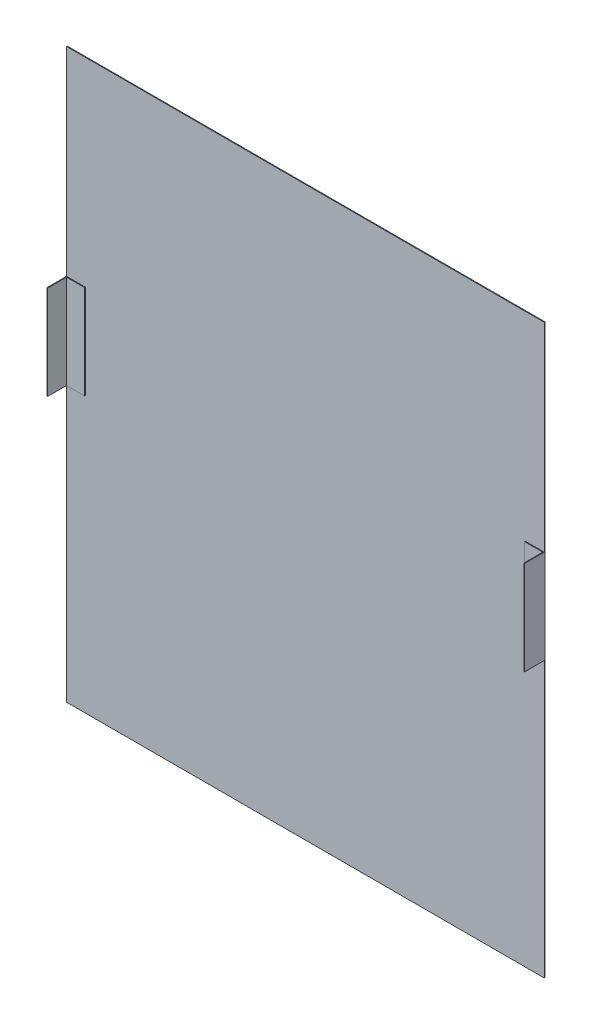
ISO-10303-21;
HEADER;
FILE_DESCRIPTION(('STEP AP214'),'2;1');
FILE_NAME('part.step','',(''),(''),'','','');
FILE_SCHEMA(('AUTOMOTIVE_DESIGN { 1 0 10303 214 1 1 1 1 }'));
ENDSEC;
DATA;
#1=APPLICATION_CONTEXT('core data for automotive mechanical design processes');
#2=APPLICATION_PROTOCOL_DEFINITION('international standard','automotive_design',2000,#1);
#3=PRODUCT_CONTEXT('',#1,'mechanical');
#4=PRODUCT('Part','Part','',(#3));
#5=PRODUCT_RELATED_PRODUCT_CATEGORY('part','',(#4));
#6=PRODUCT_DEFINITION_FORMATION('','',#4);
#7=PRODUCT_DEFINITION_CONTEXT('part definition',#1,'design');
#8=PRODUCT_DEFINITION('design','',#6,#7);
#9=PRODUCT_DEFINITION_SHAPE('','',#8);
#10=(LENGTH_UNIT() NAMED_UNIT(*) SI_UNIT(.MILLI.,.METRE.));
#11=(NAMED_UNIT(*) PLANE_ANGLE_UNIT() SI_UNIT($,.RADIAN.));
#12=(NAMED_UNIT(*) SI_UNIT($,.STERADIAN.) SOLID_ANGLE_UNIT());
#13=UNCERTAINTY_MEASURE_WITH_UNIT(LENGTH_MEASURE(1.E-05),#10,'distance_accuracy_value','');
#14=(GEOMETRIC_REPRESENTATION_CONTEXT(3) GLOBAL_UNCERTAINTY_ASSIGNED_CONTEXT((#13)) GLOBAL_UNIT_ASSIGNED_CONTEXT((#10,
#11,#12)) REPRESENTATION_CONTEXT('',''));
#15=CARTESIAN_POINT('',(0.,0.,0.));
#16=DIRECTION('',(0.,0.,1.));
#17=DIRECTION('',(1.,0.,0.));
#18=AXIS2_PLACEMENT_3D('',#15,#16,#17);
#19=CARTESIAN_POINT('',(0.,0.,1.6));
#20=DIRECTION('',(0.,0.,1.));
#21=DIRECTION('',(1.,0.,0.));
#22=AXIS2_PLACEMENT_3D('',#19,#20,#21);
#23=PLANE('',#22);
#24=DIRECTION('',(-1.,0.,0.));
#25=VECTOR('',#24,1.);
#26=CARTESIAN_POINT('',(0.,292.918789734728,1.6));
#27=LINE('',#26,#25);
#28=CARTESIAN_POINT('',(508.2,292.918789734728,1.6));
#29=VERTEX_POINT('',#28);
#30=CARTESIAN_POINT('',(489.,292.918789734728,1.6));
#31=VERTEX_POINT('',#30);
#32=EDGE_CURVE('E204',#29,#31,#27,.T.);
#33=ORIENTED_EDGE('',*,*,#32,.F.);
#34=DIRECTION('',(0.,1.,0.));
#35=VECTOR('',#34,1.);
#36=CARTESIAN_POINT('',(508.2,392.918789734728,1.6));
#37=LINE('',#36,#35);
#38=CARTESIAN_POINT('',(508.2,392.918789734728,1.6));
#39=VERTEX_POINT('',#38);
#40=EDGE_CURVE('E173',#29,#39,#37,.T.);
#41=ORIENTED_EDGE('',*,*,#40,.T.);
#42=DIRECTION('',(1.,0.,0.));
#43=VECTOR('',#42,1.);
#44=CARTESIAN_POINT('',(0.,392.918789734728,1.6));
#45=LINE('',#44,#43);
#46=CARTESIAN_POINT('',(489.,392.918789734728,1.6));
#47=VERTEX_POINT('',#46);
#48=EDGE_CURVE('E172',#47,#39,#45,.T.);
#49=ORIENTED_EDGE('',*,*,#48,.F.);
#50=DIRECTION('',(0.,-1.,0.));
#51=VECTOR('',#50,1.);
#52=CARTESIAN_POINT('',(489.,0.,1.6));
#53=LINE('',#52,#51);
#54=EDGE_CURVE('E200',#47,#31,#53,.T.);
#55=ORIENTED_EDGE('',*,*,#54,.T.);
#56=EDGE_LOOP('',(#33,#41,#49,#55));
#57=FACE_BOUND('',#56,.T.);
#58=ADVANCED_FACE('F37',(#57),#23,.T.);
#59=CARTESIAN_POINT('',(0.,0.,1.6));
#60=DIRECTION('',(0.,0.,1.));
#61=DIRECTION('',(1.,0.,0.));
#62=AXIS2_PLACEMENT_3D('',#59,#60,#61);
#63=PLANE('',#62);
#64=DIRECTION('',(1.,0.,0.));
#65=VECTOR('',#64,1.);
#66=CARTESIAN_POINT('',(0.,392.918789734728,1.6));
#67=LINE('',#66,#65);
#68=CARTESIAN_POINT('',(0.8,392.918789734728,1.6));
#69=VERTEX_POINT('',#68);
#70=CARTESIAN_POINT('',(20.,392.918789734728,1.6));
#71=VERTEX_POINT('',#70);
#72=EDGE_CURVE('E227',#69,#71,#67,.T.);
#73=ORIENTED_EDGE('',*,*,#72,.F.);
#74=DIRECTION('',(0.,-1.,0.));
#75=VECTOR('',#74,1.);
#76=CARTESIAN_POINT('',(0.8,392.918789734728,1.6));
#77=LINE('',#76,#75);
#78=CARTESIAN_POINT('',(0.8,292.918789734728,1.6));
#79=VERTEX_POINT('',#78);
#80=EDGE_CURVE('E181',#69,#79,#77,.T.);
#81=ORIENTED_EDGE('',*,*,#80,.T.);
#82=DIRECTION('',(1.,0.,0.));
#83=VECTOR('',#82,1.);
#84=CARTESIAN_POINT('',(0.,292.918789734728,1.6));
#85=LINE('',#84,#83);
#86=CARTESIAN_POINT('',(20.,292.918789734728,1.6));
#87=VERTEX_POINT('',#86);
#88=EDGE_CURVE('E230',#79,#87,#85,.T.);
#89=ORIENTED_EDGE('',*,*,#88,.T.);
#90=DIRECTION('',(0.,-1.,0.));
#91=VECTOR('',#90,1.);
#92=CARTESIAN_POINT('',(20.0000000000001,0.,1.6));
#93=LINE('',#92,#91);
#94=EDGE_CURVE('E224',#71,#87,#93,.T.);
#95=ORIENTED_EDGE('',*,*,#94,.F.);
#96=EDGE_LOOP('',(#73,#81,#89,#95));
#97=FACE_BOUND('',#96,.T.);
#98=ADVANCED_FACE('F323',(#97),#63,.T.);
#99=CARTESIAN_POINT('',(0.,0.,0.8));
#100=DIRECTION('',(0.,0.,-1.));
#101=DIRECTION('',(-1.,0.,0.));
#102=AXIS2_PLACEMENT_3D('',#99,#100,#101);
#103=PLANE('',#102);
#104=DIRECTION('',(0.,-1.,0.));
#105=VECTOR('',#104,1.);
#106=CARTESIAN_POINT('',(489.,0.,0.8));
#107=LINE('',#106,#105);
#108=CARTESIAN_POINT('',(489.,392.918789734728,0.8));
#109=VERTEX_POINT('',#108);
#110=CARTESIAN_POINT('',(489.,292.918789734728,0.8));
#111=VERTEX_POINT('',#110);
#112=EDGE_CURVE('E209',#109,#111,#107,.T.);
#113=ORIENTED_EDGE('',*,*,#112,.F.);
#114=DIRECTION('',(1.,0.,0.));
#115=VECTOR('',#114,1.);
#116=CARTESIAN_POINT('',(0.,392.918789734728,0.8));
#117=LINE('',#116,#115);
#118=CARTESIAN_POINT('',(509.,392.918789734728,0.8));
#119=VERTEX_POINT('',#118);
#120=EDGE_CURVE('E196',#109,#119,#117,.T.);
#121=ORIENTED_EDGE('',*,*,#120,.T.);
#122=DIRECTION('',(0.,1.,0.));
#123=VECTOR('',#122,1.);
#124=CARTESIAN_POINT('',(509.,0.,0.8));
#125=LINE('',#124,#123);
#126=CARTESIAN_POINT('',(509.,605.,0.8));
#127=VERTEX_POINT('',#126);
#128=EDGE_CURVE('E255',#119,#127,#125,.T.);
#129=ORIENTED_EDGE('',*,*,#128,.T.);
#130=DIRECTION('',(-1.,0.,0.));
#131=VECTOR('',#130,1.);
#132=CARTESIAN_POINT('',(0.,605.,0.8));
#133=LINE('',#132,#131);
#134=CARTESIAN_POINT('',(0.,605.,0.8));
#135=VERTEX_POINT('',#134);
#136=EDGE_CURVE('E258',#127,#135,#133,.T.);
#137=ORIENTED_EDGE('',*,*,#136,.T.);
#138=DIRECTION('',(0.,-1.,0.));
#139=VECTOR('',#138,1.);
#140=CARTESIAN_POINT('',(0.,0.,0.8));
#141=LINE('',#140,#139);
#142=CARTESIAN_POINT('',(0.,392.918789734728,0.8));
#143=VERTEX_POINT('',#142);
#144=EDGE_CURVE('E249',#135,#143,#141,.T.);
#145=ORIENTED_EDGE('',*,*,#144,.T.);
#146=DIRECTION('',(1.,0.,0.));
#147=VECTOR('',#146,1.);
#148=CARTESIAN_POINT('',(0.,392.918789734728,0.8));
#149=LINE('',#148,#147);
#150=CARTESIAN_POINT('',(20.,392.918789734728,0.8));
#151=VERTEX_POINT('',#150);
#152=EDGE_CURVE('E235',#143,#151,#149,.T.);
#153=ORIENTED_EDGE('',*,*,#152,.T.);
#154=DIRECTION('',(0.,-1.,0.));
#155=VECTOR('',#154,1.);
#156=CARTESIAN_POINT('',(20.0000000000001,0.,0.8));
#157=LINE('',#156,#155);
#158=CARTESIAN_POINT('',(20.,292.918789734728,0.8));
#159=VERTEX_POINT('',#158);
#160=EDGE_CURVE('E223',#151,#159,#157,.T.);
#161=ORIENTED_EDGE('',*,*,#160,.T.);
#162=DIRECTION('',(1.,0.,0.));
#163=VECTOR('',#162,1.);
#164=CARTESIAN_POINT('',(0.,292.918789734728,0.8));
#165=LINE('',#164,#163);
#166=CARTESIAN_POINT('',(0.,292.918789734728,0.8));
#167=VERTEX_POINT('',#166);
#168=EDGE_CURVE('E228',#167,#159,#165,.T.);
#169=ORIENTED_EDGE('',*,*,#168,.F.);
#170=CARTESIAN_POINT('',(0.,0.,0.8));
#171=VERTEX_POINT('',#170);
#172=EDGE_CURVE('E253',#167,#171,#141,.T.);
#173=ORIENTED_EDGE('',*,*,#172,.T.);
#174=DIRECTION('',(1.,0.,0.));
#175=VECTOR('',#174,1.);
#176=CARTESIAN_POINT('',(0.,0.,0.8));
#177=LINE('',#176,#175);
#178=CARTESIAN_POINT('',(509.,0.,0.8));
#179=VERTEX_POINT('',#178);
#180=EDGE_CURVE('E252',#171,#179,#177,.T.);
#181=ORIENTED_EDGE('',*,*,#180,.T.);
#182=CARTESIAN_POINT('',(509.,292.918789734728,0.8));
#183=VERTEX_POINT('',#182);
#184=EDGE_CURVE('E256',#179,#183,#125,.T.);
#185=ORIENTED_EDGE('',*,*,#184,.T.);
#186=DIRECTION('',(-1.,0.,0.));
#187=VECTOR('',#186,1.);
#188=CARTESIAN_POINT('',(0.,292.918789734728,0.8));
#189=LINE('',#188,#187);
#190=EDGE_CURVE('E201',#183,#111,#189,.T.);
#191=ORIENTED_EDGE('',*,*,#190,.T.);
#192=EDGE_LOOP('',(#113,#121,#129,#137,#145,#153,#161,#169,#173,#181,#185,#191));
#193=FACE_BOUND('',#192,.T.);
#194=ADVANCED_FACE('F295',(#193),#103,.F.);
#195=CARTESIAN_POINT('',(0.,0.,0.8));
#196=DIRECTION('',(1.,0.,0.));
#197=DIRECTION('',(0.,0.,-1.));
#198=AXIS2_PLACEMENT_3D('',#195,#196,#197);
#199=PLANE('',#198);
#200=DIRECTION('',(0.,-1.,0.));
#201=VECTOR('',#200,1.);
#202=CARTESIAN_POINT('',(0.,0.,0.));
#203=LINE('',#202,#201);
#204=CARTESIAN_POINT('',(0.,605.,0.));
#205=VERTEX_POINT('',#204);
#206=CARTESIAN_POINT('',(0.,0.,0.));
#207=VERTEX_POINT('',#206);
#208=EDGE_CURVE('E248',#205,#207,#203,.T.);
#209=ORIENTED_EDGE('',*,*,#208,.T.);
#210=DIRECTION('',(0.,0.,-1.));
#211=VECTOR('',#210,1.);
#212=CARTESIAN_POINT('',(0.,0.,0.8));
#213=LINE('',#212,#211);
#214=EDGE_CURVE('E11',#171,#207,#213,.T.);
#215=ORIENTED_EDGE('',*,*,#214,.F.);
#216=ORIENTED_EDGE('',*,*,#172,.F.);
#217=DIRECTION('',(0.,0.,-1.));
#218=VECTOR('',#217,1.);
#219=CARTESIAN_POINT('',(0.,292.918789734728,1.6));
#220=LINE('',#219,#218);
#221=CARTESIAN_POINT('',(0.,292.918789734728,21.6));
#222=VERTEX_POINT('',#221);
#223=EDGE_CURVE('E241',#222,#167,#220,.T.);
#224=ORIENTED_EDGE('',*,*,#223,.F.);
#225=DIRECTION('',(0.,1.,0.));
#226=VECTOR('',#225,1.);
#227=CARTESIAN_POINT('',(0.,392.918789734728,21.6));
#228=LINE('',#227,#226);
#229=CARTESIAN_POINT('',(0.,392.918789734728,21.6));
#230=VERTEX_POINT('',#229);
#231=EDGE_CURVE('E179',#222,#230,#228,.T.);
#232=ORIENTED_EDGE('',*,*,#231,.T.);
#233=DIRECTION('',(0.,0.,-1.));
#234=VECTOR('',#233,1.);
#235=CARTESIAN_POINT('',(0.,392.918789734728,1.6));
#236=LINE('',#235,#234);
#237=EDGE_CURVE('E243',#230,#143,#236,.T.);
#238=ORIENTED_EDGE('',*,*,#237,.T.);
#239=ORIENTED_EDGE('',*,*,#144,.F.);
#240=DIRECTION('',(0.,0.,-1.));
#241=VECTOR('',#240,1.);
#242=CARTESIAN_POINT('',(0.,605.,0.8));
#243=LINE('',#242,#241);
#244=EDGE_CURVE('E260',#135,#205,#243,.T.);
#245=ORIENTED_EDGE('',*,*,#244,.T.);
#246=EDGE_LOOP('',(#209,#215,#216,#224,#232,#238,#239,#245));
#247=FACE_BOUND('',#246,.T.);
#248=ADVANCED_FACE('F39',(#247),#199,.F.);
#249=CARTESIAN_POINT('',(0.,0.,0.8));
#250=DIRECTION('',(0.,1.,0.));
#251=DIRECTION('',(0.,0.,1.));
#252=AXIS2_PLACEMENT_3D('',#249,#250,#251);
#253=PLANE('',#252);
#254=DIRECTION('',(1.,0.,0.));
#255=VECTOR('',#254,1.);
#256=CARTESIAN_POINT('',(0.,0.,0.));
#257=LINE('',#256,#255);
#258=CARTESIAN_POINT('',(509.,0.,0.));
#259=VERTEX_POINT('',#258);
#260=EDGE_CURVE('E263',#207,#259,#257,.T.);
#261=ORIENTED_EDGE('',*,*,#260,.T.);
#262=DIRECTION('',(0.,0.,-1.));
#263=VECTOR('',#262,1.);
#264=CARTESIAN_POINT('',(509.,0.,0.8));
#265=LINE('',#264,#263);
#266=EDGE_CURVE('E45',#179,#259,#265,.T.);
#267=ORIENTED_EDGE('',*,*,#266,.F.);
#268=ORIENTED_EDGE('',*,*,#180,.F.);
#269=ORIENTED_EDGE('',*,*,#214,.T.);
#270=EDGE_LOOP('',(#261,#267,#268,#269));
#271=FACE_BOUND('',#270,.T.);
#272=ADVANCED_FACE('F307',(#271),#253,.F.);
#273=CARTESIAN_POINT('',(509.,0.,0.8));
#274=DIRECTION('',(-1.,0.,0.));
#275=DIRECTION('',(0.,0.,1.));
#276=AXIS2_PLACEMENT_3D('',#273,#274,#275);
#277=PLANE('',#276);
#278=DIRECTION('',(0.,1.,0.));
#279=VECTOR('',#278,1.);
#280=CARTESIAN_POINT('',(509.,0.,0.));
#281=LINE('',#280,#279);
#282=CARTESIAN_POINT('',(509.,605.,0.));
#283=VERTEX_POINT('',#282);
#284=EDGE_CURVE('E265',#259,#283,#281,.T.);
#285=ORIENTED_EDGE('',*,*,#284,.T.);
#286=DIRECTION('',(0.,0.,-1.));
#287=VECTOR('',#286,1.);
#288=CARTESIAN_POINT('',(509.,605.,0.8));
#289=LINE('',#288,#287);
#290=EDGE_CURVE('E271',#127,#283,#289,.T.);
#291=ORIENTED_EDGE('',*,*,#290,.F.);
#292=ORIENTED_EDGE('',*,*,#128,.F.);
#293=DIRECTION('',(0.,0.,-1.));
#294=VECTOR('',#293,1.);
#295=CARTESIAN_POINT('',(509.,392.918789734728,1.6));
#296=LINE('',#295,#294);
#297=CARTESIAN_POINT('',(509.,392.918789734728,21.6));
#298=VERTEX_POINT('',#297);
#299=EDGE_CURVE('E206',#298,#119,#296,.T.);
#300=ORIENTED_EDGE('',*,*,#299,.F.);
#301=DIRECTION('',(0.,-1.,0.));
#302=VECTOR('',#301,1.);
#303=CARTESIAN_POINT('',(509.,392.918789734728,21.6));
#304=LINE('',#303,#302);
#305=CARTESIAN_POINT('',(509.,292.918789734728,21.6));
#306=VERTEX_POINT('',#305);
#307=EDGE_CURVE('E159',#298,#306,#304,.T.);
#308=ORIENTED_EDGE('',*,*,#307,.T.);
#309=DIRECTION('',(0.,0.,-1.));
#310=VECTOR('',#309,1.);
#311=CARTESIAN_POINT('',(509.,292.918789734728,1.6));
#312=LINE('',#311,#310);
#313=EDGE_CURVE('E214',#306,#183,#312,.T.);
#314=ORIENTED_EDGE('',*,*,#313,.T.);
#315=ORIENTED_EDGE('',*,*,#184,.F.);
#316=ORIENTED_EDGE('',*,*,#266,.T.);
#317=EDGE_LOOP('',(#285,#291,#292,#300,#308,#314,#315,#316));
#318=FACE_BOUND('',#317,.T.);
#319=ADVANCED_FACE('F278',(#318),#277,.F.);
#320=CARTESIAN_POINT('',(0.,605.,0.8));
#321=DIRECTION('',(0.,-1.,0.));
#322=DIRECTION('',(0.,0.,-1.));
#323=AXIS2_PLACEMENT_3D('',#320,#321,#322);
#324=PLANE('',#323);
#325=DIRECTION('',(-1.,0.,0.));
#326=VECTOR('',#325,1.);
#327=CARTESIAN_POINT('',(0.,605.,0.));
#328=LINE('',#327,#326);
#329=EDGE_CURVE('E267',#283,#205,#328,.T.);
#330=ORIENTED_EDGE('',*,*,#329,.T.);
#331=ORIENTED_EDGE('',*,*,#244,.F.);
#332=ORIENTED_EDGE('',*,*,#136,.F.);
#333=ORIENTED_EDGE('',*,*,#290,.T.);
#334=EDGE_LOOP('',(#330,#331,#332,#333));
#335=FACE_BOUND('',#334,.T.);
#336=ADVANCED_FACE('F288',(#335),#324,.F.);
#337=CARTESIAN_POINT('',(0.,0.,0.));
#338=DIRECTION('',(0.,0.,-1.));
#339=DIRECTION('',(-1.,0.,0.));
#340=AXIS2_PLACEMENT_3D('',#337,#338,#339);
#341=PLANE('',#340);
#342=ORIENTED_EDGE('',*,*,#208,.F.);
#343=ORIENTED_EDGE('',*,*,#329,.F.);
#344=ORIENTED_EDGE('',*,*,#284,.F.);
#345=ORIENTED_EDGE('',*,*,#260,.F.);
#346=EDGE_LOOP('',(#342,#343,#344,#345));
#347=FACE_BOUND('',#346,.T.);
#348=ADVANCED_FACE('F285',(#347),#341,.T.);
#349=CARTESIAN_POINT('',(20.0000000000001,0.,1.6));
#350=DIRECTION('',(1.,0.,0.));
#351=DIRECTION('',(0.,1.,0.));
#352=AXIS2_PLACEMENT_3D('',#349,#350,#351);
#353=PLANE('',#352);
#354=ORIENTED_EDGE('',*,*,#160,.F.);
#355=DIRECTION('',(0.,0.,-1.));
#356=VECTOR('',#355,1.);
#357=CARTESIAN_POINT('',(20.,392.918789734728,1.6));
#358=LINE('',#357,#356);
#359=EDGE_CURVE('E245',#71,#151,#358,.T.);
#360=ORIENTED_EDGE('',*,*,#359,.F.);
#361=ORIENTED_EDGE('',*,*,#94,.T.);
#362=DIRECTION('',(0.,0.,-1.));
#363=VECTOR('',#362,1.);
#364=CARTESIAN_POINT('',(20.,292.918789734728,1.6));
#365=LINE('',#364,#363);
#366=EDGE_CURVE('E232',#87,#159,#365,.T.);
#367=ORIENTED_EDGE('',*,*,#366,.T.);
#368=EDGE_LOOP('',(#354,#360,#361,#367));
#369=FACE_BOUND('',#368,.T.);
#370=ADVANCED_FACE('F321',(#369),#353,.T.);
#371=CARTESIAN_POINT('',(0.,392.918789734728,1.6));
#372=DIRECTION('',(0.,1.,0.));
#373=DIRECTION('',(0.,0.,1.));
#374=AXIS2_PLACEMENT_3D('',#371,#372,#373);
#375=PLANE('',#374);
#376=ORIENTED_EDGE('',*,*,#152,.F.);
#377=ORIENTED_EDGE('',*,*,#237,.F.);
#378=DIRECTION('',(-1.,0.,0.));
#379=VECTOR('',#378,1.);
#380=CARTESIAN_POINT('',(0.8,392.918789734728,21.6));
#381=LINE('',#380,#379);
#382=CARTESIAN_POINT('',(0.8,392.918789734728,21.6));
#383=VERTEX_POINT('',#382);
#384=EDGE_CURVE('E193',#383,#230,#381,.T.);
#385=ORIENTED_EDGE('',*,*,#384,.F.);
#386=DIRECTION('',(0.,0.,-1.));
#387=VECTOR('',#386,1.);
#388=CARTESIAN_POINT('',(0.8,392.918789734728,1.6));
#389=LINE('',#388,#387);
#390=EDGE_CURVE('E187',#383,#69,#389,.T.);
#391=ORIENTED_EDGE('',*,*,#390,.T.);
#392=ORIENTED_EDGE('',*,*,#72,.T.);
#393=ORIENTED_EDGE('',*,*,#359,.T.);
#394=EDGE_LOOP('',(#376,#377,#385,#391,#392,#393));
#395=FACE_BOUND('',#394,.T.);
#396=ADVANCED_FACE('F316',(#395),#375,.T.);
#397=CARTESIAN_POINT('',(0.,292.918789734728,1.6));
#398=DIRECTION('',(0.,1.,0.));
#399=DIRECTION('',(0.,0.,1.));
#400=AXIS2_PLACEMENT_3D('',#397,#398,#399);
#401=PLANE('',#400);
#402=ORIENTED_EDGE('',*,*,#168,.T.);
#403=ORIENTED_EDGE('',*,*,#366,.F.);
#404=ORIENTED_EDGE('',*,*,#88,.F.);
#405=DIRECTION('',(0.,0.,1.));
#406=VECTOR('',#405,1.);
#407=CARTESIAN_POINT('',(0.8,292.918789734728,1.60000000000001));
#408=LINE('',#407,#406);
#409=CARTESIAN_POINT('',(0.8,292.918789734728,21.6));
#410=VERTEX_POINT('',#409);
#411=EDGE_CURVE('E60',#79,#410,#408,.T.);
#412=ORIENTED_EDGE('',*,*,#411,.T.);
#413=DIRECTION('',(-1.,0.,0.));
#414=VECTOR('',#413,1.);
#415=CARTESIAN_POINT('',(0.8,292.918789734728,21.6));
#416=LINE('',#415,#414);
#417=EDGE_CURVE('E190',#410,#222,#416,.T.);
#418=ORIENTED_EDGE('',*,*,#417,.T.);
#419=ORIENTED_EDGE('',*,*,#223,.T.);
#420=EDGE_LOOP('',(#402,#403,#404,#412,#418,#419));
#421=FACE_BOUND('',#420,.T.);
#422=ADVANCED_FACE('F310',(#421),#401,.F.);
#423=CARTESIAN_POINT('',(0.,392.918789734728,1.6));
#424=DIRECTION('',(0.,1.,0.));
#425=DIRECTION('',(0.,0.,1.));
#426=AXIS2_PLACEMENT_3D('',#423,#424,#425);
#427=PLANE('',#426);
#428=ORIENTED_EDGE('',*,*,#120,.F.);
#429=DIRECTION('',(0.,0.,-1.));
#430=VECTOR('',#429,1.);
#431=CARTESIAN_POINT('',(489.,392.918789734728,1.6));
#432=LINE('',#431,#430);
#433=EDGE_CURVE('E220',#47,#109,#432,.T.);
#434=ORIENTED_EDGE('',*,*,#433,.F.);
#435=ORIENTED_EDGE('',*,*,#48,.T.);
#436=DIRECTION('',(0.,0.,1.));
#437=VECTOR('',#436,1.);
#438=CARTESIAN_POINT('',(508.2,392.918789734728,1.6));
#439=LINE('',#438,#437);
#440=CARTESIAN_POINT('',(508.2,392.918789734728,21.6));
#441=VERTEX_POINT('',#440);
#442=EDGE_CURVE('E52',#39,#441,#439,.T.);
#443=ORIENTED_EDGE('',*,*,#442,.T.);
#444=DIRECTION('',(1.,0.,0.));
#445=VECTOR('',#444,1.);
#446=CARTESIAN_POINT('',(508.2,392.918789734728,21.6));
#447=LINE('',#446,#445);
#448=EDGE_CURVE('E153',#441,#298,#447,.T.);
#449=ORIENTED_EDGE('',*,*,#448,.T.);
#450=ORIENTED_EDGE('',*,*,#299,.T.);
#451=EDGE_LOOP('',(#428,#434,#435,#443,#449,#450));
#452=FACE_BOUND('',#451,.T.);
#453=ADVANCED_FACE('F170',(#452),#427,.T.);
#454=CARTESIAN_POINT('',(489.,0.,1.6));
#455=DIRECTION('',(1.,0.,0.));
#456=DIRECTION('',(0.,0.,-1.));
#457=AXIS2_PLACEMENT_3D('',#454,#455,#456);
#458=PLANE('',#457);
#459=ORIENTED_EDGE('',*,*,#112,.T.);
#460=DIRECTION('',(0.,0.,-1.));
#461=VECTOR('',#460,1.);
#462=CARTESIAN_POINT('',(489.,292.918789734728,1.6));
#463=LINE('',#462,#461);
#464=EDGE_CURVE('E217',#31,#111,#463,.T.);
#465=ORIENTED_EDGE('',*,*,#464,.F.);
#466=ORIENTED_EDGE('',*,*,#54,.F.);
#467=ORIENTED_EDGE('',*,*,#433,.T.);
#468=EDGE_LOOP('',(#459,#465,#466,#467));
#469=FACE_BOUND('',#468,.T.);
#470=ADVANCED_FACE('F299',(#469),#458,.F.);
#471=CARTESIAN_POINT('',(0.,292.918789734728,1.6));
#472=DIRECTION('',(0.,-1.,0.));
#473=DIRECTION('',(0.,0.,-1.));
#474=AXIS2_PLACEMENT_3D('',#471,#472,#473);
#475=PLANE('',#474);
#476=ORIENTED_EDGE('',*,*,#190,.F.);
#477=ORIENTED_EDGE('',*,*,#313,.F.);
#478=DIRECTION('',(1.,0.,0.));
#479=VECTOR('',#478,1.);
#480=CARTESIAN_POINT('',(508.2,292.918789734728,21.6));
#481=LINE('',#480,#479);
#482=CARTESIAN_POINT('',(508.2,292.918789734728,21.6));
#483=VERTEX_POINT('',#482);
#484=EDGE_CURVE('E162',#483,#306,#481,.T.);
#485=ORIENTED_EDGE('',*,*,#484,.F.);
#486=DIRECTION('',(0.,0.,-1.));
#487=VECTOR('',#486,1.);
#488=CARTESIAN_POINT('',(508.2,292.918789734728,1.6));
#489=LINE('',#488,#487);
#490=EDGE_CURVE('E163',#483,#29,#489,.T.);
#491=ORIENTED_EDGE('',*,*,#490,.T.);
#492=ORIENTED_EDGE('',*,*,#32,.T.);
#493=ORIENTED_EDGE('',*,*,#464,.T.);
#494=EDGE_LOOP('',(#476,#477,#485,#491,#492,#493));
#495=FACE_BOUND('',#494,.T.);
#496=ADVANCED_FACE('F304',(#495),#475,.T.);
#497=CARTESIAN_POINT('',(0.8,392.918789734728,21.6));
#498=DIRECTION('',(0.,0.,1.));
#499=DIRECTION('',(0.,-1.,0.));
#500=AXIS2_PLACEMENT_3D('',#497,#498,#499);
#501=PLANE('',#500);
#502=ORIENTED_EDGE('',*,*,#231,.F.);
#503=ORIENTED_EDGE('',*,*,#417,.F.);
#504=DIRECTION('',(0.,1.,0.));
#505=VECTOR('',#504,1.);
#506=CARTESIAN_POINT('',(0.8,392.918789734728,21.6));
#507=LINE('',#506,#505);
#508=EDGE_CURVE('E184',#410,#383,#507,.T.);
#509=ORIENTED_EDGE('',*,*,#508,.T.);
#510=ORIENTED_EDGE('',*,*,#384,.T.);
#511=EDGE_LOOP('',(#502,#503,#509,#510));
#512=FACE_BOUND('',#511,.T.);
#513=ADVANCED_FACE('F313',(#512),#501,.T.);
#514=CARTESIAN_POINT('',(0.8,0.,0.));
#515=DIRECTION('',(-1.,0.,0.));
#516=DIRECTION('',(0.,0.,1.));
#517=AXIS2_PLACEMENT_3D('',#514,#515,#516);
#518=PLANE('',#517);
#519=ORIENTED_EDGE('',*,*,#80,.F.);
#520=ORIENTED_EDGE('',*,*,#390,.F.);
#521=ORIENTED_EDGE('',*,*,#508,.F.);
#522=ORIENTED_EDGE('',*,*,#411,.F.);
#523=EDGE_LOOP('',(#519,#520,#521,#522));
#524=FACE_BOUND('',#523,.T.);
#525=ADVANCED_FACE('F325',(#524),#518,.F.);
#526=CARTESIAN_POINT('',(508.2,392.918789734728,21.6));
#527=DIRECTION('',(0.,0.,1.));
#528=DIRECTION('',(0.,-1.,0.));
#529=AXIS2_PLACEMENT_3D('',#526,#527,#528);
#530=PLANE('',#529);
#531=ORIENTED_EDGE('',*,*,#307,.F.);
#532=ORIENTED_EDGE('',*,*,#448,.F.);
#533=DIRECTION('',(0.,-1.,0.));
#534=VECTOR('',#533,1.);
#535=CARTESIAN_POINT('',(508.2,392.918789734728,21.6));
#536=LINE('',#535,#534);
#537=EDGE_CURVE('E156',#441,#483,#536,.T.);
#538=ORIENTED_EDGE('',*,*,#537,.T.);
#539=ORIENTED_EDGE('',*,*,#484,.T.);
#540=EDGE_LOOP('',(#531,#532,#538,#539));
#541=FACE_BOUND('',#540,.T.);
#542=ADVANCED_FACE('F154',(#541),#530,.T.);
#543=CARTESIAN_POINT('',(508.2,0.,0.));
#544=DIRECTION('',(-1.,0.,0.));
#545=DIRECTION('',(0.,0.,1.));
#546=AXIS2_PLACEMENT_3D('',#543,#544,#545);
#547=PLANE('',#546);
#548=ORIENTED_EDGE('',*,*,#40,.F.);
#549=ORIENTED_EDGE('',*,*,#490,.F.);
#550=ORIENTED_EDGE('',*,*,#537,.F.);
#551=ORIENTED_EDGE('',*,*,#442,.F.);
#552=EDGE_LOOP('',(#548,#549,#550,#551));
#553=FACE_BOUND('',#552,.T.);
#554=ADVANCED_FACE('F165',(#553),#547,.T.);
#555=CLOSED_SHELL('',(#58,#98,#194,#248,#272,#319,#336,#348,#370,#396,#422,#453,#470,#496,#513,
#525,#542,#554));
#556=MANIFOLD_SOLID_BREP('B2',#555);
#557=ADVANCED_BREP_SHAPE_REPRESENTATION('',(#18,#556),#14);
#558=SHAPE_DEFINITION_REPRESENTATION(#9,#557);
ENDSEC;
END-ISO-10303-21;
